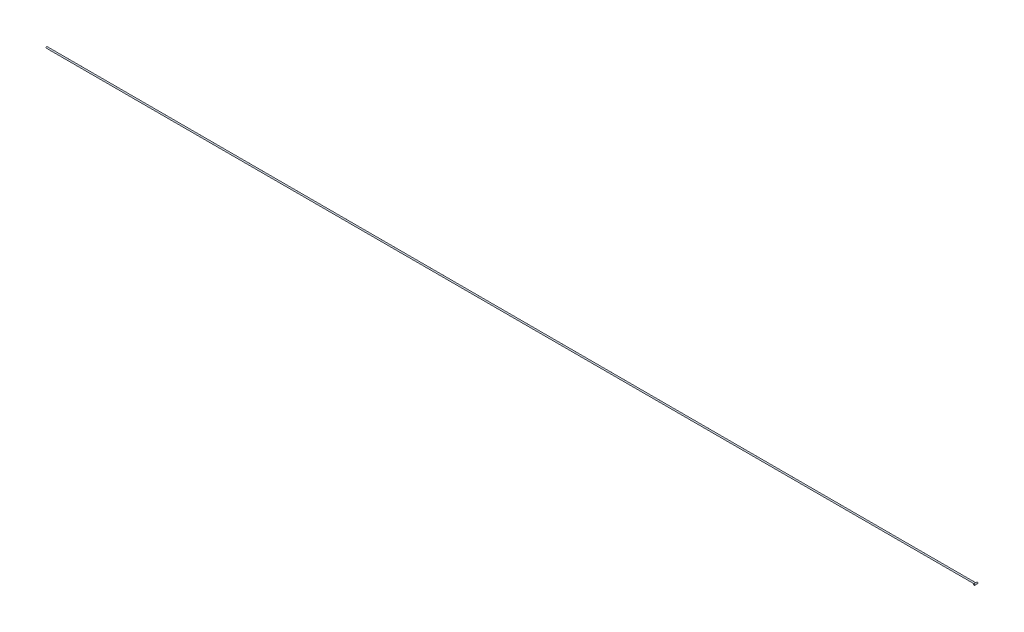
ISO-10303-21;
HEADER;
FILE_DESCRIPTION(('STEP AP214'),'2;1');
FILE_NAME('part.step','',(''),(''),'','','');
FILE_SCHEMA(('AUTOMOTIVE_DESIGN { 1 0 10303 214 1 1 1 1 }'));
ENDSEC;
DATA;
#1=APPLICATION_CONTEXT('core data for automotive mechanical design processes');
#2=APPLICATION_PROTOCOL_DEFINITION('international standard','automotive_design',2000,#1);
#3=PRODUCT_CONTEXT('',#1,'mechanical');
#4=PRODUCT('Part','Part','',(#3));
#5=PRODUCT_RELATED_PRODUCT_CATEGORY('part','',(#4));
#6=PRODUCT_DEFINITION_FORMATION('','',#4);
#7=PRODUCT_DEFINITION_CONTEXT('part definition',#1,'design');
#8=PRODUCT_DEFINITION('design','',#6,#7);
#9=PRODUCT_DEFINITION_SHAPE('','',#8);
#10=(LENGTH_UNIT() NAMED_UNIT(*) SI_UNIT(.MILLI.,.METRE.));
#11=(NAMED_UNIT(*) PLANE_ANGLE_UNIT() SI_UNIT($,.RADIAN.));
#12=(NAMED_UNIT(*) SI_UNIT($,.STERADIAN.) SOLID_ANGLE_UNIT());
#13=UNCERTAINTY_MEASURE_WITH_UNIT(LENGTH_MEASURE(1.E-05),#10,'distance_accuracy_value','');
#14=(GEOMETRIC_REPRESENTATION_CONTEXT(3) GLOBAL_UNCERTAINTY_ASSIGNED_CONTEXT((#13)) GLOBAL_UNIT_ASSIGNED_CONTEXT((#10,
#11,#12)) REPRESENTATION_CONTEXT('',''));
#15=CARTESIAN_POINT('',(0.,0.,0.));
#16=DIRECTION('',(0.,0.,1.));
#17=DIRECTION('',(1.,0.,0.));
#18=AXIS2_PLACEMENT_3D('',#15,#16,#17);
#19=CARTESIAN_POINT('',(-716.,0.,0.));
#20=DIRECTION('',(1.,0.,0.));
#21=DIRECTION('',(0.,0.,-1.));
#22=AXIS2_PLACEMENT_3D('',#19,#20,#21);
#23=PLANE('',#22);
#24=CARTESIAN_POINT('',(-716.,0.,0.));
#25=DIRECTION('',(1.,0.,0.));
#26=DIRECTION('',(0.,0.,-1.));
#27=AXIS2_PLACEMENT_3D('',#24,#25,#26);
#28=CIRCLE('',#27,1.);
#29=CARTESIAN_POINT('',(-716.,0.,-1.));
#30=VERTEX_POINT('',#29);
#31=EDGE_CURVE('E71',#30,#30,#28,.T.);
#32=ORIENTED_EDGE('',*,*,#31,.F.);
#33=EDGE_LOOP('',(#32));
#34=FACE_BOUND('',#33,.T.);
#35=ADVANCED_FACE('F51',(#34),#23,.F.);
#36=CARTESIAN_POINT('',(-716.,0.,0.));
#37=DIRECTION('',(1.,0.,0.));
#38=DIRECTION('',(0.,0.,-1.));
#39=AXIS2_PLACEMENT_3D('',#36,#37,#38);
#40=CYLINDRICAL_SURFACE('',#39,1.);
#41=CARTESIAN_POINT('',(715.999999999999,0.,0.));
#42=DIRECTION('',(0.707106781186547,0.,-0.707106781186548));
#43=DIRECTION('',(0.707106781186547,0.,0.707106781186548));
#44=AXIS2_PLACEMENT_3D('',#41,#42,#43);
#45=ELLIPSE('',#44,1.4142135623731,1.);
#46=CARTESIAN_POINT('',(715.999999999999,-1.,0.));
#47=VERTEX_POINT('',#46);
#48=CARTESIAN_POINT('',(716.,1.,-1.34015774165447E-13));
#49=VERTEX_POINT('',#48);
#50=EDGE_CURVE('E12',#47,#49,#45,.T.);
#51=ORIENTED_EDGE('',*,*,#50,.F.);
#52=CARTESIAN_POINT('',(715.999999999999,0.,0.));
#53=DIRECTION('',(0.707106781186547,0.,0.707106781186548));
#54=DIRECTION('',(0.707106781186547,0.,-0.707106781186548));
#55=AXIS2_PLACEMENT_3D('',#52,#53,#54);
#56=ELLIPSE('',#55,1.4142135623731,1.);
#57=EDGE_CURVE('E59',#49,#47,#56,.T.);
#58=ORIENTED_EDGE('',*,*,#57,.F.);
#59=EDGE_LOOP('',(#51,#58));
#60=FACE_BOUND('',#59,.T.);
#61=ORIENTED_EDGE('',*,*,#31,.T.);
#62=EDGE_LOOP('',(#61));
#63=FACE_BOUND('',#62,.T.);
#64=ADVANCED_FACE('F65',(#60,#63),#40,.T.);
#65=CARTESIAN_POINT('',(716.,0.,2.5));
#66=DIRECTION('',(0.,0.,-1.));
#67=DIRECTION('',(-1.,0.,0.));
#68=AXIS2_PLACEMENT_3D('',#65,#66,#67);
#69=PLANE('',#68);
#70=CARTESIAN_POINT('',(716.,0.,2.5));
#71=DIRECTION('',(0.,0.,-1.));
#72=DIRECTION('',(-1.,0.,0.));
#73=AXIS2_PLACEMENT_3D('',#70,#71,#72);
#74=CIRCLE('',#73,1.);
#75=CARTESIAN_POINT('',(715.,0.,2.5));
#76=VERTEX_POINT('',#75);
#77=EDGE_CURVE('E80',#76,#76,#74,.T.);
#78=ORIENTED_EDGE('',*,*,#77,.F.);
#79=EDGE_LOOP('',(#78));
#80=FACE_BOUND('',#79,.T.);
#81=ADVANCED_FACE('F86',(#80),#69,.F.);
#82=CARTESIAN_POINT('',(716.,0.,-2.5));
#83=DIRECTION('',(0.,0.,-1.));
#84=DIRECTION('',(-1.,0.,0.));
#85=AXIS2_PLACEMENT_3D('',#82,#83,#84);
#86=PLANE('',#85);
#87=CARTESIAN_POINT('',(716.,0.,-2.5));
#88=DIRECTION('',(0.,0.,-1.));
#89=DIRECTION('',(-1.,0.,0.));
#90=AXIS2_PLACEMENT_3D('',#87,#88,#89);
#91=CIRCLE('',#90,1.);
#92=CARTESIAN_POINT('',(715.,0.,-2.5));
#93=VERTEX_POINT('',#92);
#94=EDGE_CURVE('E74',#93,#93,#91,.T.);
#95=ORIENTED_EDGE('',*,*,#94,.T.);
#96=EDGE_LOOP('',(#95));
#97=FACE_BOUND('',#96,.T.);
#98=ADVANCED_FACE('F88',(#97),#86,.T.);
#99=CARTESIAN_POINT('',(716.,0.,2.5));
#100=DIRECTION('',(0.,0.,-1.));
#101=DIRECTION('',(-1.,0.,0.));
#102=AXIS2_PLACEMENT_3D('',#99,#100,#101);
#103=CYLINDRICAL_SURFACE('',#102,1.);
#104=ORIENTED_EDGE('',*,*,#57,.T.);
#105=ORIENTED_EDGE('',*,*,#50,.T.);
#106=EDGE_LOOP('',(#104,#105));
#107=FACE_BOUND('',#106,.T.);
#108=ORIENTED_EDGE('',*,*,#94,.F.);
#109=EDGE_LOOP('',(#108));
#110=FACE_BOUND('',#109,.T.);
#111=ORIENTED_EDGE('',*,*,#77,.T.);
#112=EDGE_LOOP('',(#111));
#113=FACE_BOUND('',#112,.T.);
#114=ADVANCED_FACE('F68',(#107,#110,#113),#103,.T.);
#115=CLOSED_SHELL('',(#35,#64,#81,#98,#114));
#116=MANIFOLD_SOLID_BREP('B2',#115);
#117=ADVANCED_BREP_SHAPE_REPRESENTATION('',(#18,#116),#14);
#118=SHAPE_DEFINITION_REPRESENTATION(#9,#117);
ENDSEC;
END-ISO-10303-21;
